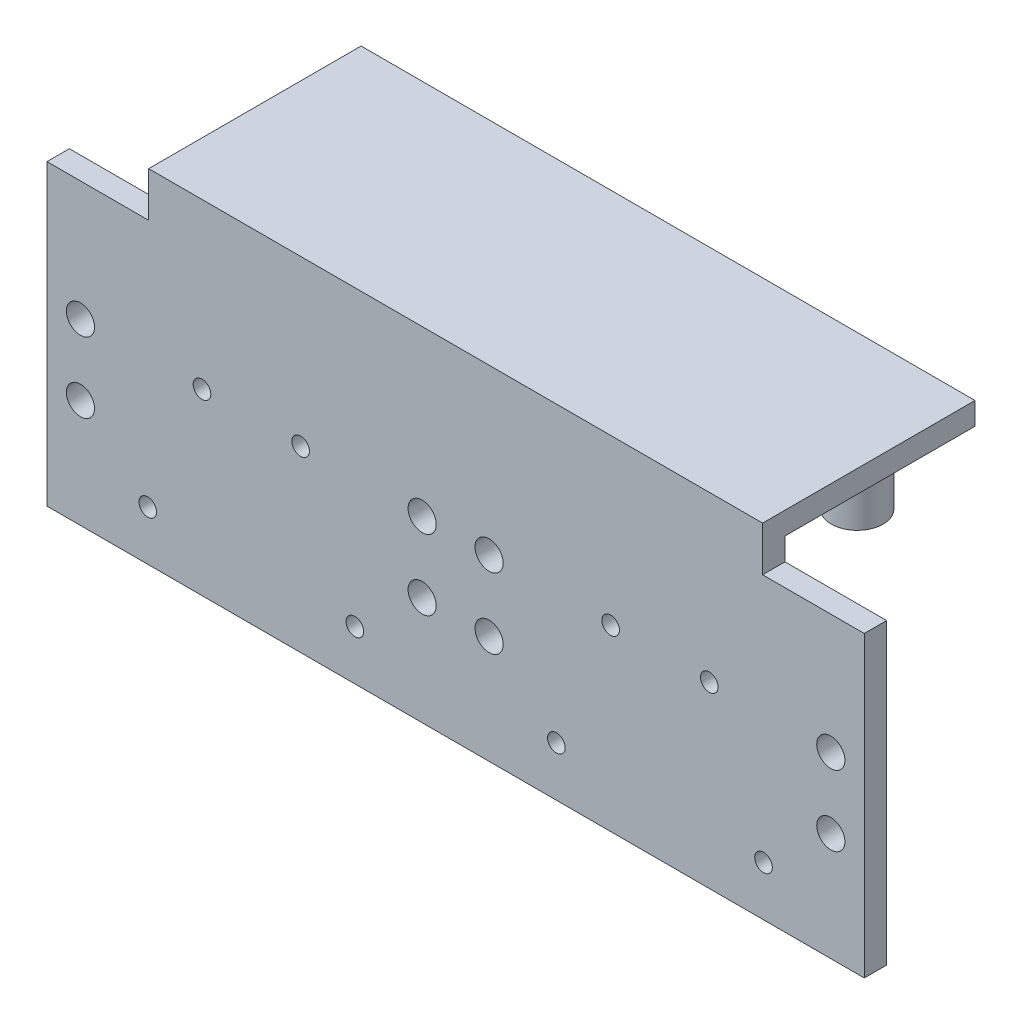
ISO-10303-21;
HEADER;
FILE_DESCRIPTION(('STEP AP214'),'2;1');
FILE_NAME('part.step','',(''),(''),'','','');
FILE_SCHEMA(('AUTOMOTIVE_DESIGN { 1 0 10303 214 1 1 1 1 }'));
ENDSEC;
DATA;
#1=APPLICATION_CONTEXT('core data for automotive mechanical design processes');
#2=APPLICATION_PROTOCOL_DEFINITION('international standard','automotive_design',2000,#1);
#3=PRODUCT_CONTEXT('',#1,'mechanical');
#4=PRODUCT('Part','Part','',(#3));
#5=PRODUCT_RELATED_PRODUCT_CATEGORY('part','',(#4));
#6=PRODUCT_DEFINITION_FORMATION('','',#4);
#7=PRODUCT_DEFINITION_CONTEXT('part definition',#1,'design');
#8=PRODUCT_DEFINITION('design','',#6,#7);
#9=PRODUCT_DEFINITION_SHAPE('','',#8);
#10=(LENGTH_UNIT() NAMED_UNIT(*) SI_UNIT(.MILLI.,.METRE.));
#11=(NAMED_UNIT(*) PLANE_ANGLE_UNIT() SI_UNIT($,.RADIAN.));
#12=(NAMED_UNIT(*) SI_UNIT($,.STERADIAN.) SOLID_ANGLE_UNIT());
#13=UNCERTAINTY_MEASURE_WITH_UNIT(LENGTH_MEASURE(1.E-05),#10,'distance_accuracy_value','');
#14=(GEOMETRIC_REPRESENTATION_CONTEXT(3) GLOBAL_UNCERTAINTY_ASSIGNED_CONTEXT((#13)) GLOBAL_UNIT_ASSIGNED_CONTEXT((#10,
#11,#12)) REPRESENTATION_CONTEXT('',''));
#15=CARTESIAN_POINT('',(0.,0.,0.));
#16=DIRECTION('',(0.,0.,1.));
#17=DIRECTION('',(1.,0.,0.));
#18=AXIS2_PLACEMENT_3D('',#15,#16,#17);
#19=CARTESIAN_POINT('',(29.0000000000001,-2.99999999999936,3.175));
#20=DIRECTION('',(-1.,0.,0.));
#21=DIRECTION('',(0.,-1.,0.));
#22=AXIS2_PLACEMENT_3D('',#19,#20,#21);
#23=PLANE('',#22);
#24=DIRECTION('',(0.,0.,-1.));
#25=VECTOR('',#24,1.);
#26=CARTESIAN_POINT('',(29.0000000000001,4.84860000000063,3.175));
#27=LINE('',#26,#25);
#28=CARTESIAN_POINT('',(29.0000000000001,4.84860000000063,3.175));
#29=VERTEX_POINT('',#28);
#30=CARTESIAN_POINT('',(29.0000000000001,4.84860000000063,0.));
#31=VERTEX_POINT('',#30);
#32=EDGE_CURVE('E174',#29,#31,#27,.T.);
#33=ORIENTED_EDGE('',*,*,#32,.F.);
#34=DIRECTION('',(0.,1.,0.));
#35=VECTOR('',#34,1.);
#36=CARTESIAN_POINT('',(29.0000000000001,-2.99999999999936,3.175));
#37=LINE('',#36,#35);
#38=CARTESIAN_POINT('',(29.0000000000001,-37.4999999999993,3.175));
#39=VERTEX_POINT('',#38);
#40=EDGE_CURVE('E131',#39,#29,#37,.T.);
#41=ORIENTED_EDGE('',*,*,#40,.F.);
#42=DIRECTION('',(0.,0.,-1.));
#43=VECTOR('',#42,1.);
#44=CARTESIAN_POINT('',(29.0000000000001,-37.4999999999993,3.175));
#45=LINE('',#44,#43);
#46=CARTESIAN_POINT('',(29.0000000000001,-37.4999999999993,0.));
#47=VERTEX_POINT('',#46);
#48=EDGE_CURVE('E133',#39,#47,#45,.T.);
#49=ORIENTED_EDGE('',*,*,#48,.T.);
#50=DIRECTION('',(0.,1.,0.));
#51=VECTOR('',#50,1.);
#52=CARTESIAN_POINT('',(29.0000000000001,-2.99999999999936,0.));
#53=LINE('',#52,#51);
#54=EDGE_CURVE('E140',#47,#31,#53,.T.);
#55=ORIENTED_EDGE('',*,*,#54,.T.);
#56=EDGE_LOOP('',(#33,#41,#49,#55));
#57=FACE_BOUND('',#56,.T.);
#58=ADVANCED_FACE('F32',(#57),#23,.F.);
#59=CARTESIAN_POINT('',(-86.9999999999995,-37.4999999999994,3.175));
#60=DIRECTION('',(1.,0.,0.));
#61=DIRECTION('',(0.,0.,-1.));
#62=AXIS2_PLACEMENT_3D('',#59,#60,#61);
#63=PLANE('',#62);
#64=DIRECTION('',(0.,0.,1.));
#65=VECTOR('',#64,1.);
#66=CARTESIAN_POINT('',(-86.9999999999995,4.84860000000063,-26.9748));
#67=LINE('',#66,#65);
#68=CARTESIAN_POINT('',(-86.9999999999995,4.84860000000063,0.));
#69=VERTEX_POINT('',#68);
#70=CARTESIAN_POINT('',(-86.9999999999995,4.84860000000063,3.175));
#71=VERTEX_POINT('',#70);
#72=EDGE_CURVE('E108',#69,#71,#67,.T.);
#73=ORIENTED_EDGE('',*,*,#72,.F.);
#74=DIRECTION('',(0.,-1.,0.));
#75=VECTOR('',#74,1.);
#76=CARTESIAN_POINT('',(-86.9999999999995,-37.4999999999994,0.));
#77=LINE('',#76,#75);
#78=CARTESIAN_POINT('',(-86.9999999999995,-37.4999999999994,0.));
#79=VERTEX_POINT('',#78);
#80=EDGE_CURVE('E143',#69,#79,#77,.T.);
#81=ORIENTED_EDGE('',*,*,#80,.T.);
#82=DIRECTION('',(0.,0.,-1.));
#83=VECTOR('',#82,1.);
#84=CARTESIAN_POINT('',(-86.9999999999995,-37.4999999999994,3.175));
#85=LINE('',#84,#83);
#86=CARTESIAN_POINT('',(-86.9999999999995,-37.4999999999994,3.175));
#87=VERTEX_POINT('',#86);
#88=EDGE_CURVE('E128',#87,#79,#85,.T.);
#89=ORIENTED_EDGE('',*,*,#88,.F.);
#90=DIRECTION('',(0.,-1.,0.));
#91=VECTOR('',#90,1.);
#92=CARTESIAN_POINT('',(-86.9999999999995,-37.4999999999994,3.175));
#93=LINE('',#92,#91);
#94=EDGE_CURVE('E121',#71,#87,#93,.T.);
#95=ORIENTED_EDGE('',*,*,#94,.F.);
#96=EDGE_LOOP('',(#73,#81,#89,#95));
#97=FACE_BOUND('',#96,.T.);
#98=ADVANCED_FACE('F126',(#97),#63,.F.);
#99=CARTESIAN_POINT('',(29.0000000000001,-37.4999999999993,3.175));
#100=DIRECTION('',(0.,1.,0.));
#101=DIRECTION('',(-1.,0.,0.));
#102=AXIS2_PLACEMENT_3D('',#99,#100,#101);
#103=PLANE('',#102);
#104=DIRECTION('',(1.,0.,0.));
#105=VECTOR('',#104,1.);
#106=CARTESIAN_POINT('',(29.0000000000001,-37.4999999999993,0.));
#107=LINE('',#106,#105);
#108=EDGE_CURVE('E136',#79,#47,#107,.T.);
#109=ORIENTED_EDGE('',*,*,#108,.T.);
#110=ORIENTED_EDGE('',*,*,#48,.F.);
#111=DIRECTION('',(1.,0.,0.));
#112=VECTOR('',#111,1.);
#113=CARTESIAN_POINT('',(29.0000000000001,-37.4999999999993,3.175));
#114=LINE('',#113,#112);
#115=EDGE_CURVE('E130',#87,#39,#114,.T.);
#116=ORIENTED_EDGE('',*,*,#115,.F.);
#117=ORIENTED_EDGE('',*,*,#88,.T.);
#118=EDGE_LOOP('',(#109,#110,#116,#117));
#119=FACE_BOUND('',#118,.T.);
#120=ADVANCED_FACE('F177',(#119),#103,.F.);
#121=CARTESIAN_POINT('',(0.,0.,3.175));
#122=DIRECTION('',(0.,0.,-1.));
#123=DIRECTION('',(-1.,0.,0.));
#124=AXIS2_PLACEMENT_3D('',#121,#122,#123);
#125=PLANE('',#124);
#126=CARTESIAN_POINT('',(-33.7499999999996,-22.1299999999992,3.175));
#127=DIRECTION('',(0.,0.,-1.));
#128=DIRECTION('',(-1.,0.,0.));
#129=AXIS2_PLACEMENT_3D('',#126,#127,#128);
#130=CIRCLE('',#129,2.);
#131=CARTESIAN_POINT('',(-35.7499999999996,-22.1299999999992,3.175));
#132=VERTEX_POINT('',#131);
#133=EDGE_CURVE('E256',#132,#132,#130,.T.);
#134=ORIENTED_EDGE('',*,*,#133,.T.);
#135=EDGE_LOOP('',(#134));
#136=FACE_BOUND('',#135,.T.);
#137=CARTESIAN_POINT('',(-82.2499999999996,-12.1299999999994,3.175));
#138=DIRECTION('',(0.,0.,-1.));
#139=DIRECTION('',(-1.,0.,0.));
#140=AXIS2_PLACEMENT_3D('',#137,#138,#139);
#141=CIRCLE('',#140,2.);
#142=CARTESIAN_POINT('',(-84.2499999999996,-12.1299999999994,3.175));
#143=VERTEX_POINT('',#142);
#144=EDGE_CURVE('E263',#143,#143,#141,.T.);
#145=ORIENTED_EDGE('',*,*,#144,.T.);
#146=EDGE_LOOP('',(#145));
#147=FACE_BOUND('',#146,.T.);
#148=CARTESIAN_POINT('',(-82.2499999999996,-22.1299999999994,3.175));
#149=DIRECTION('',(0.,0.,-1.));
#150=DIRECTION('',(-1.,0.,0.));
#151=AXIS2_PLACEMENT_3D('',#148,#149,#150);
#152=CIRCLE('',#151,2.);
#153=CARTESIAN_POINT('',(-84.2499999999996,-22.1299999999994,3.175));
#154=VERTEX_POINT('',#153);
#155=EDGE_CURVE('E244',#154,#154,#152,.T.);
#156=ORIENTED_EDGE('',*,*,#155,.T.);
#157=EDGE_LOOP('',(#156));
#158=FACE_BOUND('',#157,.T.);
#159=CARTESIAN_POINT('',(-72.6997474683054,-30.4497474683052,3.175));
#160=DIRECTION('',(0.,0.,-1.));
#161=DIRECTION('',(-1.,0.,0.));
#162=AXIS2_PLACEMENT_3D('',#159,#160,#161);
#163=CIRCLE('',#162,1.24999999999992);
#164=CARTESIAN_POINT('',(-73.9497474683053,-30.4497474683052,3.175));
#165=VERTEX_POINT('',#164);
#166=EDGE_CURVE('E251',#165,#165,#163,.T.);
#167=ORIENTED_EDGE('',*,*,#166,.T.);
#168=EDGE_LOOP('',(#167));
#169=FACE_BOUND('',#168,.T.);
#170=CARTESIAN_POINT('',(24.25,-12.1299999999999,3.175));
#171=DIRECTION('',(0.,0.,-1.));
#172=DIRECTION('',(-1.,0.,0.));
#173=AXIS2_PLACEMENT_3D('',#170,#171,#172);
#174=CIRCLE('',#173,2.);
#175=CARTESIAN_POINT('',(22.25,-12.1299999999999,3.175));
#176=VERTEX_POINT('',#175);
#177=EDGE_CURVE('E280',#176,#176,#174,.T.);
#178=ORIENTED_EDGE('',*,*,#177,.T.);
#179=EDGE_LOOP('',(#178));
#180=FACE_BOUND('',#179,.T.);
#181=CARTESIAN_POINT('',(-24.25,-12.1300000000001,3.175));
#182=DIRECTION('',(0.,0.,-1.));
#183=DIRECTION('',(-1.,0.,0.));
#184=AXIS2_PLACEMENT_3D('',#181,#182,#183);
#185=CIRCLE('',#184,2.);
#186=CARTESIAN_POINT('',(-26.25,-12.1300000000001,3.175));
#187=VERTEX_POINT('',#186);
#188=EDGE_CURVE('E287',#187,#187,#185,.T.);
#189=ORIENTED_EDGE('',*,*,#188,.T.);
#190=EDGE_LOOP('',(#189));
#191=FACE_BOUND('',#190,.T.);
#192=CARTESIAN_POINT('',(-24.25,-22.1300000000001,3.175));
#193=DIRECTION('',(0.,0.,-1.));
#194=DIRECTION('',(-1.,0.,0.));
#195=AXIS2_PLACEMENT_3D('',#192,#193,#194);
#196=CIRCLE('',#195,2.);
#197=CARTESIAN_POINT('',(-26.25,-22.1300000000001,3.175));
#198=VERTEX_POINT('',#197);
#199=EDGE_CURVE('E268',#198,#198,#196,.T.);
#200=ORIENTED_EDGE('',*,*,#199,.T.);
#201=EDGE_LOOP('',(#200));
#202=FACE_BOUND('',#201,.T.);
#203=CARTESIAN_POINT('',(-33.7499999999996,-12.1299999999992,3.175));
#204=DIRECTION('',(0.,0.,-1.));
#205=DIRECTION('',(-1.,0.,0.));
#206=AXIS2_PLACEMENT_3D('',#203,#204,#205);
#207=CIRCLE('',#206,2.);
#208=CARTESIAN_POINT('',(-35.7499999999996,-12.1299999999992,3.175));
#209=VERTEX_POINT('',#208);
#210=EDGE_CURVE('E275',#209,#209,#207,.T.);
#211=ORIENTED_EDGE('',*,*,#210,.T.);
#212=EDGE_LOOP('',(#211));
#213=FACE_BOUND('',#212,.T.);
#214=CARTESIAN_POINT('',(-64.9999999999995,-12.1299999999992,3.175));
#215=DIRECTION('',(0.,0.,-1.));
#216=DIRECTION('',(-1.,0.,0.));
#217=AXIS2_PLACEMENT_3D('',#214,#215,#216);
#218=CIRCLE('',#217,1.25);
#219=CARTESIAN_POINT('',(-66.2499999999995,-12.1299999999992,3.175));
#220=VERTEX_POINT('',#219);
#221=EDGE_CURVE('E202',#220,#220,#218,.T.);
#222=ORIENTED_EDGE('',*,*,#221,.T.);
#223=EDGE_LOOP('',(#222));
#224=FACE_BOUND('',#223,.T.);
#225=CARTESIAN_POINT('',(-50.9999999999996,-12.1299999999993,3.175));
#226=DIRECTION('',(0.,0.,-1.));
#227=DIRECTION('',(-1.,0.,0.));
#228=AXIS2_PLACEMENT_3D('',#225,#226,#227);
#229=CIRCLE('',#228,1.24999999999993);
#230=CARTESIAN_POINT('',(-52.2499999999995,-12.1299999999993,3.175));
#231=VERTEX_POINT('',#230);
#232=EDGE_CURVE('E209',#231,#231,#229,.T.);
#233=ORIENTED_EDGE('',*,*,#232,.T.);
#234=EDGE_LOOP('',(#233));
#235=FACE_BOUND('',#234,.T.);
#236=CARTESIAN_POINT('',(-43.3002525316937,-30.4497474683051,3.175));
#237=DIRECTION('',(0.,0.,-1.));
#238=DIRECTION('',(-1.,0.,0.));
#239=AXIS2_PLACEMENT_3D('',#236,#237,#238);
#240=CIRCLE('',#239,1.25000000000004);
#241=CARTESIAN_POINT('',(-44.5502525316937,-30.4497474683051,3.175));
#242=VERTEX_POINT('',#241);
#243=EDGE_CURVE('E215',#242,#242,#240,.T.);
#244=ORIENTED_EDGE('',*,*,#243,.T.);
#245=EDGE_LOOP('',(#244));
#246=FACE_BOUND('',#245,.T.);
#247=CARTESIAN_POINT('',(-14.6997474683058,-30.4497474683059,3.175));
#248=DIRECTION('',(0.,0.,-1.));
#249=DIRECTION('',(-1.,0.,0.));
#250=AXIS2_PLACEMENT_3D('',#247,#248,#249);
#251=CIRCLE('',#250,1.24999999999995);
#252=CARTESIAN_POINT('',(-15.9497474683058,-30.4497474683059,3.175));
#253=VERTEX_POINT('',#252);
#254=EDGE_CURVE('E221',#253,#253,#251,.T.);
#255=ORIENTED_EDGE('',*,*,#254,.T.);
#256=EDGE_LOOP('',(#255));
#257=FACE_BOUND('',#256,.T.);
#258=CARTESIAN_POINT('',(-7.00000000000002,-12.13,3.175));
#259=DIRECTION('',(0.,0.,-1.));
#260=DIRECTION('',(-1.,0.,0.));
#261=AXIS2_PLACEMENT_3D('',#258,#259,#260);
#262=CIRCLE('',#261,1.24999999999998);
#263=CARTESIAN_POINT('',(-8.25,-12.13,3.175));
#264=VERTEX_POINT('',#263);
#265=EDGE_CURVE('E227',#264,#264,#262,.T.);
#266=ORIENTED_EDGE('',*,*,#265,.T.);
#267=EDGE_LOOP('',(#266));
#268=FACE_BOUND('',#267,.T.);
#269=CARTESIAN_POINT('',(6.99999999999998,-12.13,3.175));
#270=DIRECTION('',(0.,0.,-1.));
#271=DIRECTION('',(-1.,0.,0.));
#272=AXIS2_PLACEMENT_3D('',#269,#270,#271);
#273=CIRCLE('',#272,1.24999999999997);
#274=CARTESIAN_POINT('',(5.75,-12.13,3.175));
#275=VERTEX_POINT('',#274);
#276=EDGE_CURVE('E233',#275,#275,#273,.T.);
#277=ORIENTED_EDGE('',*,*,#276,.T.);
#278=EDGE_LOOP('',(#277));
#279=FACE_BOUND('',#278,.T.);
#280=CARTESIAN_POINT('',(14.6997474683059,-30.4497474683058,3.175));
#281=DIRECTION('',(0.,0.,-1.));
#282=DIRECTION('',(-1.,0.,0.));
#283=AXIS2_PLACEMENT_3D('',#280,#281,#282);
#284=CIRCLE('',#283,1.25000000000006);
#285=CARTESIAN_POINT('',(13.4497474683059,-30.4497474683058,3.175));
#286=VERTEX_POINT('',#285);
#287=EDGE_CURVE('E239',#286,#286,#284,.T.);
#288=ORIENTED_EDGE('',*,*,#287,.T.);
#289=EDGE_LOOP('',(#288));
#290=FACE_BOUND('',#289,.T.);
#291=CARTESIAN_POINT('',(24.25,-22.1299999999999,3.175));
#292=DIRECTION('',(0.,0.,-1.));
#293=DIRECTION('',(-1.,0.,0.));
#294=AXIS2_PLACEMENT_3D('',#291,#292,#293);
#295=CIRCLE('',#294,2.);
#296=CARTESIAN_POINT('',(22.25,-22.1299999999999,3.175));
#297=VERTEX_POINT('',#296);
#298=EDGE_CURVE('E144',#297,#297,#295,.T.);
#299=ORIENTED_EDGE('',*,*,#298,.T.);
#300=EDGE_LOOP('',(#299));
#301=FACE_BOUND('',#300,.T.);
#302=DIRECTION('',(1.,0.,0.));
#303=VECTOR('',#302,1.);
#304=CARTESIAN_POINT('',(-86.9999999999995,11.1986000000006,3.175));
#305=LINE('',#304,#303);
#306=CARTESIAN_POINT('',(-72.5687891654232,11.1986000000006,3.175));
#307=VERTEX_POINT('',#306);
#308=CARTESIAN_POINT('',(14.5687891654238,11.1986000000006,3.175));
#309=VERTEX_POINT('',#308);
#310=EDGE_CURVE('E198',#307,#309,#305,.T.);
#311=ORIENTED_EDGE('',*,*,#310,.F.);
#312=DIRECTION('',(0.,1.,0.));
#313=VECTOR('',#312,1.);
#314=CARTESIAN_POINT('',(-72.5687891654232,4.84860000000063,3.175));
#315=LINE('',#314,#313);
#316=CARTESIAN_POINT('',(-72.5687891654232,4.84860000000063,3.175));
#317=VERTEX_POINT('',#316);
#318=EDGE_CURVE('E123',#317,#307,#315,.T.);
#319=ORIENTED_EDGE('',*,*,#318,.F.);
#320=DIRECTION('',(1.,0.,0.));
#321=VECTOR('',#320,1.);
#322=CARTESIAN_POINT('',(-86.9999999999995,4.84860000000063,3.175));
#323=LINE('',#322,#321);
#324=EDGE_CURVE('E112',#71,#317,#323,.T.);
#325=ORIENTED_EDGE('',*,*,#324,.F.);
#326=ORIENTED_EDGE('',*,*,#94,.T.);
#327=ORIENTED_EDGE('',*,*,#115,.T.);
#328=ORIENTED_EDGE('',*,*,#40,.T.);
#329=DIRECTION('',(1.,0.,0.));
#330=VECTOR('',#329,1.);
#331=CARTESIAN_POINT('',(29.0000000000001,4.84860000000063,3.175));
#332=LINE('',#331,#330);
#333=CARTESIAN_POINT('',(14.5687891654238,4.84860000000063,3.175));
#334=VERTEX_POINT('',#333);
#335=EDGE_CURVE('E572',#334,#29,#332,.T.);
#336=ORIENTED_EDGE('',*,*,#335,.F.);
#337=DIRECTION('',(0.,1.,0.));
#338=VECTOR('',#337,1.);
#339=CARTESIAN_POINT('',(14.5687891654238,4.84860000000063,3.175));
#340=LINE('',#339,#338);
#341=EDGE_CURVE('E575',#334,#309,#340,.T.);
#342=ORIENTED_EDGE('',*,*,#341,.T.);
#343=EDGE_LOOP('',(#311,#319,#325,#326,#327,#328,#336,#342));
#344=FACE_BOUND('',#343,.T.);
#345=ADVANCED_FACE('F120',(#136,#147,#158,#169,#180,#191,#202,#213,#224,#235,#246,#257,#268,
#279,#290,#301,#344),#125,.F.);
#346=CARTESIAN_POINT('',(0.,0.,0.));
#347=DIRECTION('',(0.,0.,-1.));
#348=DIRECTION('',(-1.,0.,0.));
#349=AXIS2_PLACEMENT_3D('',#346,#347,#348);
#350=PLANE('',#349);
#351=DIRECTION('',(0.,-1.,0.));
#352=VECTOR('',#351,1.);
#353=CARTESIAN_POINT('',(-72.5687891654232,0.,0.));
#354=LINE('',#353,#352);
#355=CARTESIAN_POINT('',(-72.5687891654232,8.02360000000063,0.));
#356=VERTEX_POINT('',#355);
#357=CARTESIAN_POINT('',(-72.5687891654232,4.84860000000063,0.));
#358=VERTEX_POINT('',#357);
#359=EDGE_CURVE('E178',#356,#358,#354,.T.);
#360=ORIENTED_EDGE('',*,*,#359,.F.);
#361=DIRECTION('',(-1.,0.,0.));
#362=VECTOR('',#361,1.);
#363=CARTESIAN_POINT('',(29.0000000000001,8.02360000000063,0.));
#364=LINE('',#363,#362);
#365=CARTESIAN_POINT('',(14.5687891654238,8.02360000000063,0.));
#366=VERTEX_POINT('',#365);
#367=EDGE_CURVE('E180',#366,#356,#364,.T.);
#368=ORIENTED_EDGE('',*,*,#367,.F.);
#369=DIRECTION('',(0.,1.,0.));
#370=VECTOR('',#369,1.);
#371=CARTESIAN_POINT('',(14.5687891654238,0.,0.));
#372=LINE('',#371,#370);
#373=CARTESIAN_POINT('',(14.5687891654238,4.84860000000063,0.));
#374=VERTEX_POINT('',#373);
#375=EDGE_CURVE('E168',#374,#366,#372,.T.);
#376=ORIENTED_EDGE('',*,*,#375,.F.);
#377=DIRECTION('',(1.,0.,0.));
#378=VECTOR('',#377,1.);
#379=CARTESIAN_POINT('',(0.,4.84860000000063,0.));
#380=LINE('',#379,#378);
#381=EDGE_CURVE('E39',#374,#31,#380,.T.);
#382=ORIENTED_EDGE('',*,*,#381,.T.);
#383=ORIENTED_EDGE('',*,*,#54,.F.);
#384=ORIENTED_EDGE('',*,*,#108,.F.);
#385=ORIENTED_EDGE('',*,*,#80,.F.);
#386=DIRECTION('',(1.,0.,0.));
#387=VECTOR('',#386,1.);
#388=CARTESIAN_POINT('',(0.,4.84860000000063,0.));
#389=LINE('',#388,#387);
#390=EDGE_CURVE('E11',#69,#358,#389,.T.);
#391=ORIENTED_EDGE('',*,*,#390,.T.);
#392=EDGE_LOOP('',(#360,#368,#376,#382,#383,#384,#385,#391));
#393=FACE_BOUND('',#392,.T.);
#394=CARTESIAN_POINT('',(-33.7499999999996,-22.1299999999992,0.));
#395=DIRECTION('',(0.,0.,-1.));
#396=DIRECTION('',(-1.,0.,0.));
#397=AXIS2_PLACEMENT_3D('',#394,#395,#396);
#398=CIRCLE('',#397,2.);
#399=CARTESIAN_POINT('',(-35.7499999999996,-22.1299999999992,0.));
#400=VERTEX_POINT('',#399);
#401=EDGE_CURVE('E260',#400,#400,#398,.T.);
#402=ORIENTED_EDGE('',*,*,#401,.F.);
#403=EDGE_LOOP('',(#402));
#404=FACE_BOUND('',#403,.T.);
#405=CARTESIAN_POINT('',(-82.2499999999996,-12.1299999999994,0.));
#406=DIRECTION('',(0.,0.,-1.));
#407=DIRECTION('',(-1.,0.,0.));
#408=AXIS2_PLACEMENT_3D('',#405,#406,#407);
#409=CIRCLE('',#408,2.);
#410=CARTESIAN_POINT('',(-84.2499999999996,-12.1299999999994,0.));
#411=VERTEX_POINT('',#410);
#412=EDGE_CURVE('E247',#411,#411,#409,.T.);
#413=ORIENTED_EDGE('',*,*,#412,.F.);
#414=EDGE_LOOP('',(#413));
#415=FACE_BOUND('',#414,.T.);
#416=CARTESIAN_POINT('',(-82.2499999999996,-22.1299999999994,0.));
#417=DIRECTION('',(0.,0.,-1.));
#418=DIRECTION('',(-1.,0.,0.));
#419=AXIS2_PLACEMENT_3D('',#416,#417,#418);
#420=CIRCLE('',#419,2.);
#421=CARTESIAN_POINT('',(-84.2499999999996,-22.1299999999994,0.));
#422=VERTEX_POINT('',#421);
#423=EDGE_CURVE('E248',#422,#422,#420,.T.);
#424=ORIENTED_EDGE('',*,*,#423,.F.);
#425=EDGE_LOOP('',(#424));
#426=FACE_BOUND('',#425,.T.);
#427=CARTESIAN_POINT('',(-72.6997474683054,-30.4497474683052,0.));
#428=DIRECTION('',(0.,0.,-1.));
#429=DIRECTION('',(-1.,0.,0.));
#430=AXIS2_PLACEMENT_3D('',#427,#428,#429);
#431=CIRCLE('',#430,1.24999999999992);
#432=CARTESIAN_POINT('',(-73.9497474683053,-30.4497474683052,0.));
#433=VERTEX_POINT('',#432);
#434=EDGE_CURVE('E205',#433,#433,#431,.T.);
#435=ORIENTED_EDGE('',*,*,#434,.F.);
#436=EDGE_LOOP('',(#435));
#437=FACE_BOUND('',#436,.T.);
#438=CARTESIAN_POINT('',(24.25,-12.1299999999999,0.));
#439=DIRECTION('',(0.,0.,-1.));
#440=DIRECTION('',(-1.,0.,0.));
#441=AXIS2_PLACEMENT_3D('',#438,#439,#440);
#442=CIRCLE('',#441,2.);
#443=CARTESIAN_POINT('',(22.25,-12.1299999999999,0.));
#444=VERTEX_POINT('',#443);
#445=EDGE_CURVE('E284',#444,#444,#442,.T.);
#446=ORIENTED_EDGE('',*,*,#445,.F.);
#447=EDGE_LOOP('',(#446));
#448=FACE_BOUND('',#447,.T.);
#449=CARTESIAN_POINT('',(-24.25,-12.1300000000001,0.));
#450=DIRECTION('',(0.,0.,-1.));
#451=DIRECTION('',(-1.,0.,0.));
#452=AXIS2_PLACEMENT_3D('',#449,#450,#451);
#453=CIRCLE('',#452,2.);
#454=CARTESIAN_POINT('',(-26.25,-12.1300000000001,0.));
#455=VERTEX_POINT('',#454);
#456=EDGE_CURVE('E271',#455,#455,#453,.T.);
#457=ORIENTED_EDGE('',*,*,#456,.F.);
#458=EDGE_LOOP('',(#457));
#459=FACE_BOUND('',#458,.T.);
#460=CARTESIAN_POINT('',(-24.25,-22.1300000000001,0.));
#461=DIRECTION('',(0.,0.,-1.));
#462=DIRECTION('',(-1.,0.,0.));
#463=AXIS2_PLACEMENT_3D('',#460,#461,#462);
#464=CIRCLE('',#463,2.);
#465=CARTESIAN_POINT('',(-26.25,-22.1300000000001,0.));
#466=VERTEX_POINT('',#465);
#467=EDGE_CURVE('E272',#466,#466,#464,.T.);
#468=ORIENTED_EDGE('',*,*,#467,.F.);
#469=EDGE_LOOP('',(#468));
#470=FACE_BOUND('',#469,.T.);
#471=CARTESIAN_POINT('',(-33.7499999999996,-12.1299999999992,0.));
#472=DIRECTION('',(0.,0.,-1.));
#473=DIRECTION('',(-1.,0.,0.));
#474=AXIS2_PLACEMENT_3D('',#471,#472,#473);
#475=CIRCLE('',#474,2.);
#476=CARTESIAN_POINT('',(-35.7499999999996,-12.1299999999992,0.));
#477=VERTEX_POINT('',#476);
#478=EDGE_CURVE('E259',#477,#477,#475,.T.);
#479=ORIENTED_EDGE('',*,*,#478,.F.);
#480=EDGE_LOOP('',(#479));
#481=FACE_BOUND('',#480,.T.);
#482=CARTESIAN_POINT('',(-64.9999999999995,-12.1299999999992,0.));
#483=DIRECTION('',(0.,0.,-1.));
#484=DIRECTION('',(-1.,0.,0.));
#485=AXIS2_PLACEMENT_3D('',#482,#483,#484);
#486=CIRCLE('',#485,1.25);
#487=CARTESIAN_POINT('',(-66.2499999999995,-12.1299999999992,0.));
#488=VERTEX_POINT('',#487);
#489=EDGE_CURVE('E206',#488,#488,#486,.T.);
#490=ORIENTED_EDGE('',*,*,#489,.F.);
#491=EDGE_LOOP('',(#490));
#492=FACE_BOUND('',#491,.T.);
#493=CARTESIAN_POINT('',(-50.9999999999996,-12.1299999999993,0.));
#494=DIRECTION('',(0.,0.,-1.));
#495=DIRECTION('',(-1.,0.,0.));
#496=AXIS2_PLACEMENT_3D('',#493,#494,#495);
#497=CIRCLE('',#496,1.24999999999993);
#498=CARTESIAN_POINT('',(-52.2499999999995,-12.1299999999993,0.));
#499=VERTEX_POINT('',#498);
#500=EDGE_CURVE('E212',#499,#499,#497,.T.);
#501=ORIENTED_EDGE('',*,*,#500,.F.);
#502=EDGE_LOOP('',(#501));
#503=FACE_BOUND('',#502,.T.);
#504=CARTESIAN_POINT('',(-43.3002525316937,-30.4497474683051,0.));
#505=DIRECTION('',(0.,0.,-1.));
#506=DIRECTION('',(-1.,0.,0.));
#507=AXIS2_PLACEMENT_3D('',#504,#505,#506);
#508=CIRCLE('',#507,1.25000000000004);
#509=CARTESIAN_POINT('',(-44.5502525316937,-30.4497474683051,0.));
#510=VERTEX_POINT('',#509);
#511=EDGE_CURVE('E218',#510,#510,#508,.T.);
#512=ORIENTED_EDGE('',*,*,#511,.F.);
#513=EDGE_LOOP('',(#512));
#514=FACE_BOUND('',#513,.T.);
#515=CARTESIAN_POINT('',(-14.6997474683058,-30.4497474683059,0.));
#516=DIRECTION('',(0.,0.,-1.));
#517=DIRECTION('',(-1.,0.,0.));
#518=AXIS2_PLACEMENT_3D('',#515,#516,#517);
#519=CIRCLE('',#518,1.24999999999995);
#520=CARTESIAN_POINT('',(-15.9497474683058,-30.4497474683059,0.));
#521=VERTEX_POINT('',#520);
#522=EDGE_CURVE('E224',#521,#521,#519,.T.);
#523=ORIENTED_EDGE('',*,*,#522,.F.);
#524=EDGE_LOOP('',(#523));
#525=FACE_BOUND('',#524,.T.);
#526=CARTESIAN_POINT('',(-7.00000000000002,-12.13,0.));
#527=DIRECTION('',(0.,0.,-1.));
#528=DIRECTION('',(-1.,0.,0.));
#529=AXIS2_PLACEMENT_3D('',#526,#527,#528);
#530=CIRCLE('',#529,1.24999999999998);
#531=CARTESIAN_POINT('',(-8.25,-12.13,0.));
#532=VERTEX_POINT('',#531);
#533=EDGE_CURVE('E230',#532,#532,#530,.T.);
#534=ORIENTED_EDGE('',*,*,#533,.F.);
#535=EDGE_LOOP('',(#534));
#536=FACE_BOUND('',#535,.T.);
#537=CARTESIAN_POINT('',(6.99999999999998,-12.13,0.));
#538=DIRECTION('',(0.,0.,-1.));
#539=DIRECTION('',(-1.,0.,0.));
#540=AXIS2_PLACEMENT_3D('',#537,#538,#539);
#541=CIRCLE('',#540,1.24999999999997);
#542=CARTESIAN_POINT('',(5.75,-12.13,0.));
#543=VERTEX_POINT('',#542);
#544=EDGE_CURVE('E236',#543,#543,#541,.T.);
#545=ORIENTED_EDGE('',*,*,#544,.F.);
#546=EDGE_LOOP('',(#545));
#547=FACE_BOUND('',#546,.T.);
#548=CARTESIAN_POINT('',(14.6997474683059,-30.4497474683058,0.));
#549=DIRECTION('',(0.,0.,-1.));
#550=DIRECTION('',(-1.,0.,0.));
#551=AXIS2_PLACEMENT_3D('',#548,#549,#550);
#552=CIRCLE('',#551,1.25000000000006);
#553=CARTESIAN_POINT('',(13.4497474683059,-30.4497474683058,0.));
#554=VERTEX_POINT('',#553);
#555=EDGE_CURVE('E201',#554,#554,#552,.T.);
#556=ORIENTED_EDGE('',*,*,#555,.F.);
#557=EDGE_LOOP('',(#556));
#558=FACE_BOUND('',#557,.T.);
#559=CARTESIAN_POINT('',(24.25,-22.1299999999999,0.));
#560=DIRECTION('',(0.,0.,-1.));
#561=DIRECTION('',(-1.,0.,0.));
#562=AXIS2_PLACEMENT_3D('',#559,#560,#561);
#563=CIRCLE('',#562,2.);
#564=CARTESIAN_POINT('',(22.25,-22.1299999999999,0.));
#565=VERTEX_POINT('',#564);
#566=EDGE_CURVE('E283',#565,#565,#563,.T.);
#567=ORIENTED_EDGE('',*,*,#566,.F.);
#568=EDGE_LOOP('',(#567));
#569=FACE_BOUND('',#568,.T.);
#570=ADVANCED_FACE('F164',(#393,#404,#415,#426,#437,#448,#459,#470,#481,#492,#503,#514,#525,
#536,#547,#558,#569),#350,.T.);
#571=CARTESIAN_POINT('',(24.25,-22.1299999999999,3.175));
#572=DIRECTION('',(0.,0.,-1.));
#573=DIRECTION('',(-1.,0.,0.));
#574=AXIS2_PLACEMENT_3D('',#571,#572,#573);
#575=CYLINDRICAL_SURFACE('',#574,2.);
#576=ORIENTED_EDGE('',*,*,#298,.F.);
#577=EDGE_LOOP('',(#576));
#578=FACE_BOUND('',#577,.T.);
#579=ORIENTED_EDGE('',*,*,#566,.T.);
#580=EDGE_LOOP('',(#579));
#581=FACE_BOUND('',#580,.T.);
#582=ADVANCED_FACE('F296',(#578,#581),#575,.F.);
#583=CARTESIAN_POINT('',(14.6997474683059,-30.4497474683058,3.175));
#584=DIRECTION('',(0.,0.,-1.));
#585=DIRECTION('',(-1.,0.,0.));
#586=AXIS2_PLACEMENT_3D('',#583,#584,#585);
#587=CYLINDRICAL_SURFACE('',#586,1.25000000000006);
#588=ORIENTED_EDGE('',*,*,#287,.F.);
#589=EDGE_LOOP('',(#588));
#590=FACE_BOUND('',#589,.T.);
#591=ORIENTED_EDGE('',*,*,#555,.T.);
#592=EDGE_LOOP('',(#591));
#593=FACE_BOUND('',#592,.T.);
#594=ADVANCED_FACE('F305',(#590,#593),#587,.F.);
#595=CARTESIAN_POINT('',(6.99999999999998,-12.13,3.175));
#596=DIRECTION('',(0.,0.,-1.));
#597=DIRECTION('',(-1.,0.,0.));
#598=AXIS2_PLACEMENT_3D('',#595,#596,#597);
#599=CYLINDRICAL_SURFACE('',#598,1.24999999999997);
#600=ORIENTED_EDGE('',*,*,#276,.F.);
#601=EDGE_LOOP('',(#600));
#602=FACE_BOUND('',#601,.T.);
#603=ORIENTED_EDGE('',*,*,#544,.T.);
#604=EDGE_LOOP('',(#603));
#605=FACE_BOUND('',#604,.T.);
#606=ADVANCED_FACE('F331',(#602,#605),#599,.F.);
#607=CARTESIAN_POINT('',(-7.00000000000002,-12.13,3.175));
#608=DIRECTION('',(0.,0.,-1.));
#609=DIRECTION('',(-1.,0.,0.));
#610=AXIS2_PLACEMENT_3D('',#607,#608,#609);
#611=CYLINDRICAL_SURFACE('',#610,1.24999999999998);
#612=ORIENTED_EDGE('',*,*,#265,.F.);
#613=EDGE_LOOP('',(#612));
#614=FACE_BOUND('',#613,.T.);
#615=ORIENTED_EDGE('',*,*,#533,.T.);
#616=EDGE_LOOP('',(#615));
#617=FACE_BOUND('',#616,.T.);
#618=ADVANCED_FACE('F339',(#614,#617),#611,.F.);
#619=CARTESIAN_POINT('',(-14.6997474683058,-30.4497474683059,3.175));
#620=DIRECTION('',(0.,0.,-1.));
#621=DIRECTION('',(-1.,0.,0.));
#622=AXIS2_PLACEMENT_3D('',#619,#620,#621);
#623=CYLINDRICAL_SURFACE('',#622,1.24999999999995);
#624=ORIENTED_EDGE('',*,*,#254,.F.);
#625=EDGE_LOOP('',(#624));
#626=FACE_BOUND('',#625,.T.);
#627=ORIENTED_EDGE('',*,*,#522,.T.);
#628=EDGE_LOOP('',(#627));
#629=FACE_BOUND('',#628,.T.);
#630=ADVANCED_FACE('F347',(#626,#629),#623,.F.);
#631=CARTESIAN_POINT('',(-43.3002525316937,-30.4497474683051,3.175));
#632=DIRECTION('',(0.,0.,-1.));
#633=DIRECTION('',(-1.,0.,0.));
#634=AXIS2_PLACEMENT_3D('',#631,#632,#633);
#635=CYLINDRICAL_SURFACE('',#634,1.25000000000004);
#636=ORIENTED_EDGE('',*,*,#243,.F.);
#637=EDGE_LOOP('',(#636));
#638=FACE_BOUND('',#637,.T.);
#639=ORIENTED_EDGE('',*,*,#511,.T.);
#640=EDGE_LOOP('',(#639));
#641=FACE_BOUND('',#640,.T.);
#642=ADVANCED_FACE('F355',(#638,#641),#635,.F.);
#643=CARTESIAN_POINT('',(-50.9999999999996,-12.1299999999993,3.175));
#644=DIRECTION('',(0.,0.,-1.));
#645=DIRECTION('',(-1.,0.,0.));
#646=AXIS2_PLACEMENT_3D('',#643,#644,#645);
#647=CYLINDRICAL_SURFACE('',#646,1.24999999999993);
#648=ORIENTED_EDGE('',*,*,#232,.F.);
#649=EDGE_LOOP('',(#648));
#650=FACE_BOUND('',#649,.T.);
#651=ORIENTED_EDGE('',*,*,#500,.T.);
#652=EDGE_LOOP('',(#651));
#653=FACE_BOUND('',#652,.T.);
#654=ADVANCED_FACE('F363',(#650,#653),#647,.F.);
#655=CARTESIAN_POINT('',(-64.9999999999995,-12.1299999999992,3.175));
#656=DIRECTION('',(0.,0.,-1.));
#657=DIRECTION('',(-1.,0.,0.));
#658=AXIS2_PLACEMENT_3D('',#655,#656,#657);
#659=CYLINDRICAL_SURFACE('',#658,1.25);
#660=ORIENTED_EDGE('',*,*,#221,.F.);
#661=EDGE_LOOP('',(#660));
#662=FACE_BOUND('',#661,.T.);
#663=ORIENTED_EDGE('',*,*,#489,.T.);
#664=EDGE_LOOP('',(#663));
#665=FACE_BOUND('',#664,.T.);
#666=ADVANCED_FACE('F371',(#662,#665),#659,.F.);
#667=CARTESIAN_POINT('',(-33.7499999999996,-12.1299999999992,3.175));
#668=DIRECTION('',(0.,0.,-1.));
#669=DIRECTION('',(-1.,0.,0.));
#670=AXIS2_PLACEMENT_3D('',#667,#668,#669);
#671=CYLINDRICAL_SURFACE('',#670,2.);
#672=ORIENTED_EDGE('',*,*,#210,.F.);
#673=EDGE_LOOP('',(#672));
#674=FACE_BOUND('',#673,.T.);
#675=ORIENTED_EDGE('',*,*,#478,.T.);
#676=EDGE_LOOP('',(#675));
#677=FACE_BOUND('',#676,.T.);
#678=ADVANCED_FACE('F379',(#674,#677),#671,.F.);
#679=CARTESIAN_POINT('',(-24.25,-22.1300000000001,3.175));
#680=DIRECTION('',(0.,0.,-1.));
#681=DIRECTION('',(-1.,0.,0.));
#682=AXIS2_PLACEMENT_3D('',#679,#680,#681);
#683=CYLINDRICAL_SURFACE('',#682,2.);
#684=ORIENTED_EDGE('',*,*,#199,.F.);
#685=EDGE_LOOP('',(#684));
#686=FACE_BOUND('',#685,.T.);
#687=ORIENTED_EDGE('',*,*,#467,.T.);
#688=EDGE_LOOP('',(#687));
#689=FACE_BOUND('',#688,.T.);
#690=ADVANCED_FACE('F387',(#686,#689),#683,.F.);
#691=CARTESIAN_POINT('',(-24.25,-12.1300000000001,3.175));
#692=DIRECTION('',(0.,0.,-1.));
#693=DIRECTION('',(-1.,0.,0.));
#694=AXIS2_PLACEMENT_3D('',#691,#692,#693);
#695=CYLINDRICAL_SURFACE('',#694,2.);
#696=ORIENTED_EDGE('',*,*,#188,.F.);
#697=EDGE_LOOP('',(#696));
#698=FACE_BOUND('',#697,.T.);
#699=ORIENTED_EDGE('',*,*,#456,.T.);
#700=EDGE_LOOP('',(#699));
#701=FACE_BOUND('',#700,.T.);
#702=ADVANCED_FACE('F395',(#698,#701),#695,.F.);
#703=CARTESIAN_POINT('',(24.25,-12.1299999999999,3.175));
#704=DIRECTION('',(0.,0.,-1.));
#705=DIRECTION('',(-1.,0.,0.));
#706=AXIS2_PLACEMENT_3D('',#703,#704,#705);
#707=CYLINDRICAL_SURFACE('',#706,2.);
#708=ORIENTED_EDGE('',*,*,#177,.F.);
#709=EDGE_LOOP('',(#708));
#710=FACE_BOUND('',#709,.T.);
#711=ORIENTED_EDGE('',*,*,#445,.T.);
#712=EDGE_LOOP('',(#711));
#713=FACE_BOUND('',#712,.T.);
#714=ADVANCED_FACE('F403',(#710,#713),#707,.F.);
#715=CARTESIAN_POINT('',(-72.6997474683054,-30.4497474683052,3.175));
#716=DIRECTION('',(0.,0.,-1.));
#717=DIRECTION('',(-1.,0.,0.));
#718=AXIS2_PLACEMENT_3D('',#715,#716,#717);
#719=CYLINDRICAL_SURFACE('',#718,1.24999999999992);
#720=ORIENTED_EDGE('',*,*,#166,.F.);
#721=EDGE_LOOP('',(#720));
#722=FACE_BOUND('',#721,.T.);
#723=ORIENTED_EDGE('',*,*,#434,.T.);
#724=EDGE_LOOP('',(#723));
#725=FACE_BOUND('',#724,.T.);
#726=ADVANCED_FACE('F411',(#722,#725),#719,.F.);
#727=CARTESIAN_POINT('',(-82.2499999999996,-22.1299999999994,3.175));
#728=DIRECTION('',(0.,0.,-1.));
#729=DIRECTION('',(-1.,0.,0.));
#730=AXIS2_PLACEMENT_3D('',#727,#728,#729);
#731=CYLINDRICAL_SURFACE('',#730,2.);
#732=ORIENTED_EDGE('',*,*,#155,.F.);
#733=EDGE_LOOP('',(#732));
#734=FACE_BOUND('',#733,.T.);
#735=ORIENTED_EDGE('',*,*,#423,.T.);
#736=EDGE_LOOP('',(#735));
#737=FACE_BOUND('',#736,.T.);
#738=ADVANCED_FACE('F419',(#734,#737),#731,.F.);
#739=CARTESIAN_POINT('',(-82.2499999999996,-12.1299999999994,3.175));
#740=DIRECTION('',(0.,0.,-1.));
#741=DIRECTION('',(-1.,0.,0.));
#742=AXIS2_PLACEMENT_3D('',#739,#740,#741);
#743=CYLINDRICAL_SURFACE('',#742,2.);
#744=ORIENTED_EDGE('',*,*,#144,.F.);
#745=EDGE_LOOP('',(#744));
#746=FACE_BOUND('',#745,.T.);
#747=ORIENTED_EDGE('',*,*,#412,.T.);
#748=EDGE_LOOP('',(#747));
#749=FACE_BOUND('',#748,.T.);
#750=ADVANCED_FACE('F427',(#746,#749),#743,.F.);
#751=CARTESIAN_POINT('',(-33.7499999999996,-22.1299999999992,3.175));
#752=DIRECTION('',(0.,0.,-1.));
#753=DIRECTION('',(-1.,0.,0.));
#754=AXIS2_PLACEMENT_3D('',#751,#752,#753);
#755=CYLINDRICAL_SURFACE('',#754,2.);
#756=ORIENTED_EDGE('',*,*,#133,.F.);
#757=EDGE_LOOP('',(#756));
#758=FACE_BOUND('',#757,.T.);
#759=ORIENTED_EDGE('',*,*,#401,.T.);
#760=EDGE_LOOP('',(#759));
#761=FACE_BOUND('',#760,.T.);
#762=ADVANCED_FACE('F435',(#758,#761),#755,.F.);
#763=CARTESIAN_POINT('',(0.,11.1986000000006,0.));
#764=DIRECTION('',(0.,1.,0.));
#765=DIRECTION('',(0.,0.,1.));
#766=AXIS2_PLACEMENT_3D('',#763,#764,#765);
#767=PLANE('',#766);
#768=DIRECTION('',(0.,0.,-1.));
#769=VECTOR('',#768,1.);
#770=CARTESIAN_POINT('',(-72.5687891654232,11.1986000000006,-26.9748));
#771=LINE('',#770,#769);
#772=CARTESIAN_POINT('',(-72.5687891654232,11.1986000000006,-26.9748));
#773=VERTEX_POINT('',#772);
#774=EDGE_CURVE('E46',#307,#773,#771,.T.);
#775=ORIENTED_EDGE('',*,*,#774,.F.);
#776=ORIENTED_EDGE('',*,*,#310,.T.);
#777=DIRECTION('',(0.,0.,1.));
#778=VECTOR('',#777,1.);
#779=CARTESIAN_POINT('',(14.5687891654238,11.1986000000006,3.175));
#780=LINE('',#779,#778);
#781=CARTESIAN_POINT('',(14.5687891654238,11.1986000000006,-26.9748));
#782=VERTEX_POINT('',#781);
#783=EDGE_CURVE('E577',#782,#309,#780,.T.);
#784=ORIENTED_EDGE('',*,*,#783,.F.);
#785=DIRECTION('',(1.,0.,0.));
#786=VECTOR('',#785,1.);
#787=CARTESIAN_POINT('',(29.0000000000001,11.1986000000006,-26.9748));
#788=LINE('',#787,#786);
#789=EDGE_CURVE('E192',#773,#782,#788,.T.);
#790=ORIENTED_EDGE('',*,*,#789,.F.);
#791=EDGE_LOOP('',(#775,#776,#784,#790));
#792=FACE_BOUND('',#791,.T.);
#793=ADVANCED_FACE('F443',(#792),#767,.T.);
#794=CARTESIAN_POINT('',(29.0000000000001,8.02360000000063,-26.9748));
#795=DIRECTION('',(0.,1.,0.));
#796=DIRECTION('',(0.,0.,1.));
#797=AXIS2_PLACEMENT_3D('',#794,#795,#796);
#798=PLANE('',#797);
#799=CARTESIAN_POINT('',(-68.0499999999993,8.02360000000063,-14.9699999999999));
#800=DIRECTION('',(0.,1.,0.));
#801=DIRECTION('',(0.,0.,1.));
#802=AXIS2_PLACEMENT_3D('',#799,#800,#801);
#803=CIRCLE('',#802,3.671158804611);
#804=CARTESIAN_POINT('',(-68.0499999999993,8.02360000000063,-11.2988411953889));
#805=VERTEX_POINT('',#804);
#806=EDGE_CURVE('E153',#805,#805,#803,.F.);
#807=ORIENTED_EDGE('',*,*,#806,.F.);
#808=EDGE_LOOP('',(#807));
#809=FACE_BOUND('',#808,.T.);
#810=CARTESIAN_POINT('',(10.0499999999999,8.02360000000063,-14.77));
#811=DIRECTION('',(0.,1.,0.));
#812=DIRECTION('',(0.,0.,1.));
#813=AXIS2_PLACEMENT_3D('',#810,#811,#812);
#814=CIRCLE('',#813,3.67835452054103);
#815=CARTESIAN_POINT('',(10.0499999999999,8.02360000000063,-11.091645479459));
#816=VERTEX_POINT('',#815);
#817=EDGE_CURVE('E150',#816,#816,#814,.F.);
#818=ORIENTED_EDGE('',*,*,#817,.F.);
#819=EDGE_LOOP('',(#818));
#820=FACE_BOUND('',#819,.T.);
#821=ORIENTED_EDGE('',*,*,#367,.T.);
#822=DIRECTION('',(0.,0.,-1.));
#823=VECTOR('',#822,1.);
#824=CARTESIAN_POINT('',(-72.5687891654232,8.02360000000063,-26.9748));
#825=LINE('',#824,#823);
#826=CARTESIAN_POINT('',(-72.5687891654232,8.02360000000063,-26.9748));
#827=VERTEX_POINT('',#826);
#828=EDGE_CURVE('E182',#356,#827,#825,.T.);
#829=ORIENTED_EDGE('',*,*,#828,.T.);
#830=DIRECTION('',(-1.,0.,0.));
#831=VECTOR('',#830,1.);
#832=CARTESIAN_POINT('',(29.0000000000001,8.02360000000063,-26.9748));
#833=LINE('',#832,#831);
#834=CARTESIAN_POINT('',(14.5687891654238,8.02360000000063,-26.9748));
#835=VERTEX_POINT('',#834);
#836=EDGE_CURVE('E189',#835,#827,#833,.T.);
#837=ORIENTED_EDGE('',*,*,#836,.F.);
#838=DIRECTION('',(0.,0.,1.));
#839=VECTOR('',#838,1.);
#840=CARTESIAN_POINT('',(14.5687891654238,8.02360000000063,-26.9748));
#841=LINE('',#840,#839);
#842=EDGE_CURVE('E54',#835,#366,#841,.T.);
#843=ORIENTED_EDGE('',*,*,#842,.T.);
#844=EDGE_LOOP('',(#821,#829,#837,#843));
#845=FACE_BOUND('',#844,.T.);
#846=ADVANCED_FACE('F186',(#809,#820,#845),#798,.F.);
#847=CARTESIAN_POINT('',(0.,0.,-26.9748));
#848=DIRECTION('',(0.,0.,-1.));
#849=DIRECTION('',(-1.,0.,0.));
#850=AXIS2_PLACEMENT_3D('',#847,#848,#849);
#851=PLANE('',#850);
#852=DIRECTION('',(0.,-1.,0.));
#853=VECTOR('',#852,1.);
#854=CARTESIAN_POINT('',(-72.5687891654232,0.,-26.9748));
#855=LINE('',#854,#853);
#856=EDGE_CURVE('E158',#773,#827,#855,.T.);
#857=ORIENTED_EDGE('',*,*,#856,.F.);
#858=ORIENTED_EDGE('',*,*,#789,.T.);
#859=DIRECTION('',(0.,1.,0.));
#860=VECTOR('',#859,1.);
#861=CARTESIAN_POINT('',(14.5687891654238,0.,-26.9748));
#862=LINE('',#861,#860);
#863=EDGE_CURVE('E156',#835,#782,#862,.T.);
#864=ORIENTED_EDGE('',*,*,#863,.F.);
#865=ORIENTED_EDGE('',*,*,#836,.T.);
#866=EDGE_LOOP('',(#857,#858,#864,#865));
#867=FACE_BOUND('',#866,.T.);
#868=ADVANCED_FACE('F474',(#867),#851,.T.);
#869=CARTESIAN_POINT('',(10.0499999999999,1.67360000000063,-14.77));
#870=DIRECTION('',(0.,1.,0.));
#871=DIRECTION('',(0.,0.,1.));
#872=AXIS2_PLACEMENT_3D('',#869,#870,#871);
#873=CYLINDRICAL_SURFACE('',#872,3.67835452054103);
#874=CARTESIAN_POINT('',(10.0499999999999,1.67360000000063,-14.77));
#875=DIRECTION('',(0.,-1.,0.));
#876=DIRECTION('',(0.,0.,-1.));
#877=AXIS2_PLACEMENT_3D('',#874,#875,#876);
#878=CIRCLE('',#877,3.67835452054103);
#879=CARTESIAN_POINT('',(10.0499999999999,1.67360000000063,-18.448354520541));
#880=VERTEX_POINT('',#879);
#881=EDGE_CURVE('E190',#880,#880,#878,.T.);
#882=ORIENTED_EDGE('',*,*,#881,.F.);
#883=EDGE_LOOP('',(#882));
#884=FACE_BOUND('',#883,.T.);
#885=ORIENTED_EDGE('',*,*,#817,.T.);
#886=EDGE_LOOP('',(#885));
#887=FACE_BOUND('',#886,.T.);
#888=ADVANCED_FACE('F484',(#884,#887),#873,.T.);
#889=CARTESIAN_POINT('',(10.0499999999999,1.67360000000063,-14.77));
#890=DIRECTION('',(0.,-1.,0.));
#891=DIRECTION('',(0.,0.,-1.));
#892=AXIS2_PLACEMENT_3D('',#889,#890,#891);
#893=PLANE('',#892);
#894=ORIENTED_EDGE('',*,*,#881,.T.);
#895=EDGE_LOOP('',(#894));
#896=FACE_BOUND('',#895,.T.);
#897=ADVANCED_FACE('F494',(#896),#893,.T.);
#898=CARTESIAN_POINT('',(-68.0499999999993,1.67360000000063,-14.9699999999999));
#899=DIRECTION('',(0.,1.,0.));
#900=DIRECTION('',(0.,0.,1.));
#901=AXIS2_PLACEMENT_3D('',#898,#899,#900);
#902=CYLINDRICAL_SURFACE('',#901,3.671158804611);
#903=CARTESIAN_POINT('',(-68.0499999999993,1.67360000000063,-14.9699999999999));
#904=DIRECTION('',(0.,-1.,0.));
#905=DIRECTION('',(0.,0.,-1.));
#906=AXIS2_PLACEMENT_3D('',#903,#904,#905);
#907=CIRCLE('',#906,3.671158804611);
#908=CARTESIAN_POINT('',(-68.0499999999993,1.67360000000063,-18.6411588046109));
#909=VERTEX_POINT('',#908);
#910=EDGE_CURVE('E181',#909,#909,#907,.T.);
#911=ORIENTED_EDGE('',*,*,#910,.F.);
#912=EDGE_LOOP('',(#911));
#913=FACE_BOUND('',#912,.T.);
#914=ORIENTED_EDGE('',*,*,#806,.T.);
#915=EDGE_LOOP('',(#914));
#916=FACE_BOUND('',#915,.T.);
#917=ADVANCED_FACE('F501',(#913,#916),#902,.T.);
#918=CARTESIAN_POINT('',(-68.0499999999993,1.67360000000063,-14.9699999999999));
#919=DIRECTION('',(0.,-1.,0.));
#920=DIRECTION('',(0.,0.,-1.));
#921=AXIS2_PLACEMENT_3D('',#918,#919,#920);
#922=PLANE('',#921);
#923=ORIENTED_EDGE('',*,*,#910,.T.);
#924=EDGE_LOOP('',(#923));
#925=FACE_BOUND('',#924,.T.);
#926=ADVANCED_FACE('F509',(#925),#922,.T.);
#927=CARTESIAN_POINT('',(14.5687891654238,4.84860000000063,3.175));
#928=DIRECTION('',(-1.,0.,0.));
#929=DIRECTION('',(0.,0.,1.));
#930=AXIS2_PLACEMENT_3D('',#927,#928,#929);
#931=PLANE('',#930);
#932=ORIENTED_EDGE('',*,*,#375,.T.);
#933=ORIENTED_EDGE('',*,*,#842,.F.);
#934=ORIENTED_EDGE('',*,*,#863,.T.);
#935=ORIENTED_EDGE('',*,*,#783,.T.);
#936=ORIENTED_EDGE('',*,*,#341,.F.);
#937=DIRECTION('',(0.,0.,1.));
#938=VECTOR('',#937,1.);
#939=CARTESIAN_POINT('',(14.5687891654238,4.84860000000063,3.175));
#940=LINE('',#939,#938);
#941=EDGE_CURVE('E569',#374,#334,#940,.T.);
#942=ORIENTED_EDGE('',*,*,#941,.F.);
#943=EDGE_LOOP('',(#932,#933,#934,#935,#936,#942));
#944=FACE_BOUND('',#943,.T.);
#945=ADVANCED_FACE('F516',(#944),#931,.F.);
#946=CARTESIAN_POINT('',(0.,4.84860000000063,0.));
#947=DIRECTION('',(0.,1.,0.));
#948=DIRECTION('',(0.,0.,1.));
#949=AXIS2_PLACEMENT_3D('',#946,#947,#948);
#950=PLANE('',#949);
#951=ORIENTED_EDGE('',*,*,#941,.T.);
#952=ORIENTED_EDGE('',*,*,#335,.T.);
#953=ORIENTED_EDGE('',*,*,#32,.T.);
#954=ORIENTED_EDGE('',*,*,#381,.F.);
#955=EDGE_LOOP('',(#951,#952,#953,#954));
#956=FACE_BOUND('',#955,.T.);
#957=ADVANCED_FACE('F535',(#956),#950,.T.);
#958=CARTESIAN_POINT('',(-72.5687891654232,4.84860000000063,-26.9748));
#959=DIRECTION('',(1.,0.,0.));
#960=DIRECTION('',(0.,0.,-1.));
#961=AXIS2_PLACEMENT_3D('',#958,#959,#960);
#962=PLANE('',#961);
#963=ORIENTED_EDGE('',*,*,#359,.T.);
#964=DIRECTION('',(0.,0.,-1.));
#965=VECTOR('',#964,1.);
#966=CARTESIAN_POINT('',(-72.5687891654232,4.84860000000063,-26.9748));
#967=LINE('',#966,#965);
#968=EDGE_CURVE('E124',#317,#358,#967,.T.);
#969=ORIENTED_EDGE('',*,*,#968,.F.);
#970=ORIENTED_EDGE('',*,*,#318,.T.);
#971=ORIENTED_EDGE('',*,*,#774,.T.);
#972=ORIENTED_EDGE('',*,*,#856,.T.);
#973=ORIENTED_EDGE('',*,*,#828,.F.);
#974=EDGE_LOOP('',(#963,#969,#970,#971,#972,#973));
#975=FACE_BOUND('',#974,.T.);
#976=ADVANCED_FACE('F542',(#975),#962,.F.);
#977=CARTESIAN_POINT('',(0.,4.84860000000063,0.));
#978=DIRECTION('',(0.,1.,0.));
#979=DIRECTION('',(0.,0.,1.));
#980=AXIS2_PLACEMENT_3D('',#977,#978,#979);
#981=PLANE('',#980);
#982=ORIENTED_EDGE('',*,*,#72,.T.);
#983=ORIENTED_EDGE('',*,*,#324,.T.);
#984=ORIENTED_EDGE('',*,*,#968,.T.);
#985=ORIENTED_EDGE('',*,*,#390,.F.);
#986=EDGE_LOOP('',(#982,#983,#984,#985));
#987=FACE_BOUND('',#986,.T.);
#988=ADVANCED_FACE('F110',(#987),#981,.T.);
#989=CLOSED_SHELL('',(#58,#98,#120,#345,#570,#582,#594,#606,#618,#630,#642,#654,#666,#678,#690,
#702,#714,#726,#738,#750,#762,#793,#846,#868,#888,#897,#917,#926,#945,#957,#976,#988));
#990=MANIFOLD_SOLID_BREP('B2',#989);
#991=ADVANCED_BREP_SHAPE_REPRESENTATION('',(#18,#990),#14);
#992=SHAPE_DEFINITION_REPRESENTATION(#9,#991);
ENDSEC;
END-ISO-10303-21;
